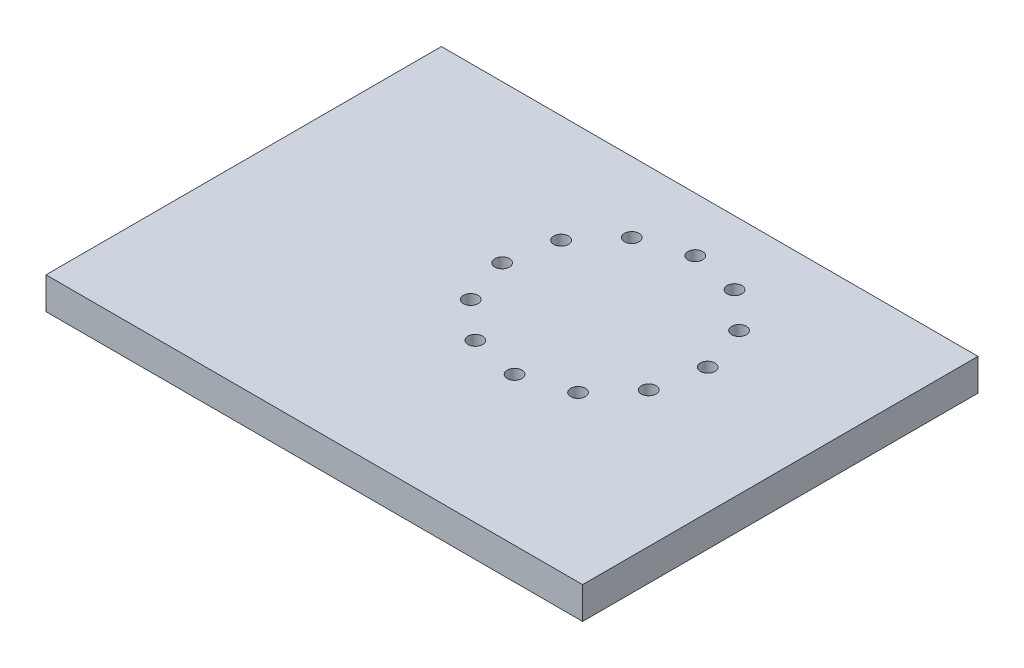
ISO-10303-21;
HEADER;
FILE_DESCRIPTION(('STEP AP214'),'2;1');
FILE_NAME('part.step','',(''),(''),'','','');
FILE_SCHEMA(('AUTOMOTIVE_DESIGN { 1 0 10303 214 1 1 1 1 }'));
ENDSEC;
DATA;
#1=APPLICATION_CONTEXT('core data for automotive mechanical design processes');
#2=APPLICATION_PROTOCOL_DEFINITION('international standard','automotive_design',2000,#1);
#3=PRODUCT_CONTEXT('',#1,'mechanical');
#4=PRODUCT('Part','Part','',(#3));
#5=PRODUCT_RELATED_PRODUCT_CATEGORY('part','',(#4));
#6=PRODUCT_DEFINITION_FORMATION('','',#4);
#7=PRODUCT_DEFINITION_CONTEXT('part definition',#1,'design');
#8=PRODUCT_DEFINITION('design','',#6,#7);
#9=PRODUCT_DEFINITION_SHAPE('','',#8);
#10=(LENGTH_UNIT() NAMED_UNIT(*) SI_UNIT(.MILLI.,.METRE.));
#11=(NAMED_UNIT(*) PLANE_ANGLE_UNIT() SI_UNIT($,.RADIAN.));
#12=(NAMED_UNIT(*) SI_UNIT($,.STERADIAN.) SOLID_ANGLE_UNIT());
#13=UNCERTAINTY_MEASURE_WITH_UNIT(LENGTH_MEASURE(1.E-05),#10,'distance_accuracy_value','');
#14=(GEOMETRIC_REPRESENTATION_CONTEXT(3) GLOBAL_UNCERTAINTY_ASSIGNED_CONTEXT((#13)) GLOBAL_UNIT_ASSIGNED_CONTEXT((#10,
#11,#12)) REPRESENTATION_CONTEXT('',''));
#15=CARTESIAN_POINT('',(0.,0.,0.));
#16=DIRECTION('',(0.,0.,1.));
#17=DIRECTION('',(1.,0.,0.));
#18=AXIS2_PLACEMENT_3D('',#15,#16,#17);
#19=CARTESIAN_POINT('',(0.,14.351,0.));
#20=DIRECTION('',(1.,0.,0.));
#21=DIRECTION('',(0.,0.,-1.));
#22=AXIS2_PLACEMENT_3D('',#19,#20,#21);
#23=PLANE('',#22);
#24=DIRECTION('',(0.,0.,1.));
#25=VECTOR('',#24,1.);
#26=CARTESIAN_POINT('',(0.,0.,0.));
#27=LINE('',#26,#25);
#28=CARTESIAN_POINT('',(0.,0.,-177.8));
#29=VERTEX_POINT('',#28);
#30=CARTESIAN_POINT('',(0.,0.,0.));
#31=VERTEX_POINT('',#30);
#32=EDGE_CURVE('E112',#29,#31,#27,.T.);
#33=ORIENTED_EDGE('',*,*,#32,.T.);
#34=DIRECTION('',(0.,-1.,0.));
#35=VECTOR('',#34,1.);
#36=CARTESIAN_POINT('',(0.,14.351,0.));
#37=LINE('',#36,#35);
#38=CARTESIAN_POINT('',(0.,14.351,0.));
#39=VERTEX_POINT('',#38);
#40=EDGE_CURVE('E12',#39,#31,#37,.T.);
#41=ORIENTED_EDGE('',*,*,#40,.F.);
#42=DIRECTION('',(0.,0.,1.));
#43=VECTOR('',#42,1.);
#44=CARTESIAN_POINT('',(0.,14.351,0.));
#45=LINE('',#44,#43);
#46=CARTESIAN_POINT('',(0.,14.351,-177.8));
#47=VERTEX_POINT('',#46);
#48=EDGE_CURVE('E100',#47,#39,#45,.T.);
#49=ORIENTED_EDGE('',*,*,#48,.F.);
#50=DIRECTION('',(0.,-1.,0.));
#51=VECTOR('',#50,1.);
#52=CARTESIAN_POINT('',(0.,14.351,-177.8));
#53=LINE('',#52,#51);
#54=EDGE_CURVE('E108',#47,#29,#53,.T.);
#55=ORIENTED_EDGE('',*,*,#54,.T.);
#56=EDGE_LOOP('',(#33,#41,#49,#55));
#57=FACE_BOUND('',#56,.T.);
#58=ADVANCED_FACE('F47',(#57),#23,.F.);
#59=CARTESIAN_POINT('',(0.,14.351,0.));
#60=DIRECTION('',(0.,0.,-1.));
#61=DIRECTION('',(-1.,0.,0.));
#62=AXIS2_PLACEMENT_3D('',#59,#60,#61);
#63=PLANE('',#62);
#64=DIRECTION('',(1.,0.,0.));
#65=VECTOR('',#64,1.);
#66=CARTESIAN_POINT('',(0.,0.,0.));
#67=LINE('',#66,#65);
#68=CARTESIAN_POINT('',(241.3,0.,0.));
#69=VERTEX_POINT('',#68);
#70=EDGE_CURVE('E104',#31,#69,#67,.T.);
#71=ORIENTED_EDGE('',*,*,#70,.T.);
#72=DIRECTION('',(0.,-1.,0.));
#73=VECTOR('',#72,1.);
#74=CARTESIAN_POINT('',(241.3,14.351,0.));
#75=LINE('',#74,#73);
#76=CARTESIAN_POINT('',(241.3,14.351,0.));
#77=VERTEX_POINT('',#76);
#78=EDGE_CURVE('E55',#77,#69,#75,.T.);
#79=ORIENTED_EDGE('',*,*,#78,.F.);
#80=DIRECTION('',(1.,0.,0.));
#81=VECTOR('',#80,1.);
#82=CARTESIAN_POINT('',(0.,14.351,0.));
#83=LINE('',#82,#81);
#84=EDGE_CURVE('E95',#39,#77,#83,.T.);
#85=ORIENTED_EDGE('',*,*,#84,.F.);
#86=ORIENTED_EDGE('',*,*,#40,.T.);
#87=EDGE_LOOP('',(#71,#79,#85,#86));
#88=FACE_BOUND('',#87,.T.);
#89=ADVANCED_FACE('F103',(#88),#63,.F.);
#90=CARTESIAN_POINT('',(241.3,14.351,0.));
#91=DIRECTION('',(-1.,0.,0.));
#92=DIRECTION('',(0.,0.,1.));
#93=AXIS2_PLACEMENT_3D('',#90,#91,#92);
#94=PLANE('',#93);
#95=DIRECTION('',(0.,0.,-1.));
#96=VECTOR('',#95,1.);
#97=CARTESIAN_POINT('',(241.3,0.,0.));
#98=LINE('',#97,#96);
#99=CARTESIAN_POINT('',(241.3,0.,-177.8));
#100=VERTEX_POINT('',#99);
#101=EDGE_CURVE('E82',#69,#100,#98,.T.);
#102=ORIENTED_EDGE('',*,*,#101,.T.);
#103=DIRECTION('',(0.,-1.,0.));
#104=VECTOR('',#103,1.);
#105=CARTESIAN_POINT('',(241.3,14.351,-177.8));
#106=LINE('',#105,#104);
#107=CARTESIAN_POINT('',(241.3,14.351,-177.8));
#108=VERTEX_POINT('',#107);
#109=EDGE_CURVE('E105',#108,#100,#106,.T.);
#110=ORIENTED_EDGE('',*,*,#109,.F.);
#111=DIRECTION('',(0.,0.,-1.));
#112=VECTOR('',#111,1.);
#113=CARTESIAN_POINT('',(241.3,14.351,0.));
#114=LINE('',#113,#112);
#115=EDGE_CURVE('E98',#77,#108,#114,.T.);
#116=ORIENTED_EDGE('',*,*,#115,.F.);
#117=ORIENTED_EDGE('',*,*,#78,.T.);
#118=EDGE_LOOP('',(#102,#110,#116,#117));
#119=FACE_BOUND('',#118,.T.);
#120=ADVANCED_FACE('F106',(#119),#94,.F.);
#121=CARTESIAN_POINT('',(0.,14.351,-177.8));
#122=DIRECTION('',(0.,0.,1.));
#123=DIRECTION('',(1.,0.,0.));
#124=AXIS2_PLACEMENT_3D('',#121,#122,#123);
#125=PLANE('',#124);
#126=DIRECTION('',(-1.,0.,0.));
#127=VECTOR('',#126,1.);
#128=CARTESIAN_POINT('',(0.,0.,-177.8));
#129=LINE('',#128,#127);
#130=EDGE_CURVE('E88',#100,#29,#129,.T.);
#131=ORIENTED_EDGE('',*,*,#130,.T.);
#132=ORIENTED_EDGE('',*,*,#54,.F.);
#133=DIRECTION('',(-1.,0.,0.));
#134=VECTOR('',#133,1.);
#135=CARTESIAN_POINT('',(0.,14.351,-177.8));
#136=LINE('',#135,#134);
#137=EDGE_CURVE('E65',#108,#47,#136,.T.);
#138=ORIENTED_EDGE('',*,*,#137,.F.);
#139=ORIENTED_EDGE('',*,*,#109,.T.);
#140=EDGE_LOOP('',(#131,#132,#138,#139));
#141=FACE_BOUND('',#140,.T.);
#142=ADVANCED_FACE('F120',(#141),#125,.F.);
#143=CARTESIAN_POINT('',(0.,14.351,0.));
#144=DIRECTION('',(0.,-1.,0.));
#145=DIRECTION('',(0.,0.,-1.));
#146=AXIS2_PLACEMENT_3D('',#143,#144,#145);
#147=PLANE('',#146);
#148=CARTESIAN_POINT('',(122.030882614296,14.351,-71.0203254002302));
#149=DIRECTION('',(0.,1.,0.));
#150=DIRECTION('',(0.,0.,1.));
#151=AXIS2_PLACEMENT_3D('',#148,#149,#150);
#152=CIRCLE('',#151,3.3);
#153=CARTESIAN_POINT('',(122.030882614296,14.351,-67.7203254002302));
#154=VERTEX_POINT('',#153);
#155=EDGE_CURVE('E219',#154,#154,#152,.T.);
#156=ORIENTED_EDGE('',*,*,#155,.F.);
#157=EDGE_LOOP('',(#156));
#158=FACE_BOUND('',#157,.T.);
#159=CARTESIAN_POINT('',(165.441282741422,14.351,-73.8108757790625));
#160=DIRECTION('',(0.,1.,0.));
#161=DIRECTION('',(0.,0.,1.));
#162=AXIS2_PLACEMENT_3D('',#159,#160,#161);
#163=CIRCLE('',#162,3.29999999999998);
#164=CARTESIAN_POINT('',(165.441282741422,14.351,-70.5108757790625));
#165=VERTEX_POINT('',#164);
#166=EDGE_CURVE('E134',#165,#165,#163,.T.);
#167=ORIENTED_EDGE('',*,*,#166,.F.);
#168=EDGE_LOOP('',(#167));
#169=FACE_BOUND('',#168,.T.);
#170=CARTESIAN_POINT('',(144.109945538082,14.351,-66.5997097610587));
#171=DIRECTION('',(0.,1.,0.));
#172=DIRECTION('',(0.,0.,1.));
#173=AXIS2_PLACEMENT_3D('',#170,#171,#172);
#174=CIRCLE('',#173,3.29999999999998);
#175=CARTESIAN_POINT('',(144.109945538082,14.351,-63.2997097610587));
#176=VERTEX_POINT('',#175);
#177=EDGE_CURVE('E212',#176,#176,#174,.T.);
#178=ORIENTED_EDGE('',*,*,#177,.F.);
#179=EDGE_LOOP('',(#178));
#180=FACE_BOUND('',#179,.T.);
#181=CARTESIAN_POINT('',(105.120161050127,14.351,-85.8882223060128));
#182=DIRECTION('',(0.,1.,0.));
#183=DIRECTION('',(0.,0.,1.));
#184=AXIS2_PLACEMENT_3D('',#181,#182,#183);
#185=CIRCLE('',#184,3.29999999999999);
#186=CARTESIAN_POINT('',(105.120161050127,14.351,-82.5882223060128));
#187=VERTEX_POINT('',#186);
#188=EDGE_CURVE('E203',#187,#187,#185,.T.);
#189=ORIENTED_EDGE('',*,*,#188,.F.);
#190=EDGE_LOOP('',(#189));
#191=FACE_BOUND('',#190,.T.);
#192=CARTESIAN_POINT('',(97.9089950321234,14.351,-107.219559509353));
#193=DIRECTION('',(0.,1.,0.));
#194=DIRECTION('',(0.,0.,1.));
#195=AXIS2_PLACEMENT_3D('',#192,#193,#194);
#196=CIRCLE('',#195,3.3);
#197=CARTESIAN_POINT('',(97.9089950321234,14.351,-103.919559509353));
#198=VERTEX_POINT('',#197);
#199=EDGE_CURVE('E196',#198,#198,#196,.T.);
#200=ORIENTED_EDGE('',*,*,#199,.F.);
#201=EDGE_LOOP('',(#200));
#202=FACE_BOUND('',#201,.T.);
#203=CARTESIAN_POINT('',(102.329610671295,14.351,-129.298622433139));
#204=DIRECTION('',(0.,1.,0.));
#205=DIRECTION('',(0.,0.,1.));
#206=AXIS2_PLACEMENT_3D('',#203,#204,#205);
#207=CIRCLE('',#206,3.29999999999998);
#208=CARTESIAN_POINT('',(102.329610671295,14.351,-125.998622433139));
#209=VERTEX_POINT('',#208);
#210=EDGE_CURVE('E189',#209,#209,#207,.T.);
#211=ORIENTED_EDGE('',*,*,#210,.F.);
#212=EDGE_LOOP('',(#211));
#213=FACE_BOUND('',#212,.T.);
#214=CARTESIAN_POINT('',(117.197507577078,14.351,-146.209343997307));
#215=DIRECTION('',(0.,1.,0.));
#216=DIRECTION('',(0.,0.,1.));
#217=AXIS2_PLACEMENT_3D('',#214,#215,#216);
#218=CIRCLE('',#217,3.3);
#219=CARTESIAN_POINT('',(117.197507577078,14.351,-142.909343997307));
#220=VERTEX_POINT('',#219);
#221=EDGE_CURVE('E181',#220,#220,#218,.T.);
#222=ORIENTED_EDGE('',*,*,#221,.F.);
#223=EDGE_LOOP('',(#222));
#224=FACE_BOUND('',#223,.T.);
#225=CARTESIAN_POINT('',(138.528844780417,14.351,-153.420510015311));
#226=DIRECTION('',(0.,1.,0.));
#227=DIRECTION('',(0.,0.,1.));
#228=AXIS2_PLACEMENT_3D('',#225,#226,#227);
#229=CIRCLE('',#228,3.29999999999998);
#230=CARTESIAN_POINT('',(138.528844780417,14.351,-150.120510015311));
#231=VERTEX_POINT('',#230);
#232=EDGE_CURVE('E174',#231,#231,#229,.T.);
#233=ORIENTED_EDGE('',*,*,#232,.F.);
#234=EDGE_LOOP('',(#233));
#235=FACE_BOUND('',#234,.T.);
#236=CARTESIAN_POINT('',(160.607907704203,14.351,-148.99989437614));
#237=DIRECTION('',(0.,1.,0.));
#238=DIRECTION('',(0.,0.,1.));
#239=AXIS2_PLACEMENT_3D('',#236,#237,#238);
#240=CIRCLE('',#239,3.3);
#241=CARTESIAN_POINT('',(160.607907704203,14.351,-145.69989437614));
#242=VERTEX_POINT('',#241);
#243=EDGE_CURVE('E163',#242,#242,#240,.T.);
#244=ORIENTED_EDGE('',*,*,#243,.F.);
#245=EDGE_LOOP('',(#244));
#246=FACE_BOUND('',#245,.T.);
#247=CARTESIAN_POINT('',(177.518629268372,14.351,-134.131997470357));
#248=DIRECTION('',(0.,1.,0.));
#249=DIRECTION('',(0.,0.,1.));
#250=AXIS2_PLACEMENT_3D('',#247,#248,#249);
#251=CIRCLE('',#250,3.3);
#252=CARTESIAN_POINT('',(177.518629268372,14.351,-130.831997470357));
#253=VERTEX_POINT('',#252);
#254=EDGE_CURVE('E155',#253,#253,#251,.T.);
#255=ORIENTED_EDGE('',*,*,#254,.F.);
#256=EDGE_LOOP('',(#255));
#257=FACE_BOUND('',#256,.T.);
#258=CARTESIAN_POINT('',(184.729795286376,14.351,-112.800660267017));
#259=DIRECTION('',(0.,1.,0.));
#260=DIRECTION('',(0.,0.,1.));
#261=AXIS2_PLACEMENT_3D('',#258,#259,#260);
#262=CIRCLE('',#261,3.29999999999998);
#263=CARTESIAN_POINT('',(184.729795286376,14.351,-109.500660267017));
#264=VERTEX_POINT('',#263);
#265=EDGE_CURVE('E148',#264,#264,#262,.T.);
#266=ORIENTED_EDGE('',*,*,#265,.F.);
#267=EDGE_LOOP('',(#266));
#268=FACE_BOUND('',#267,.T.);
#269=CARTESIAN_POINT('',(180.309179647204,14.351,-90.7215973432309));
#270=DIRECTION('',(0.,1.,0.));
#271=DIRECTION('',(0.,0.,1.));
#272=AXIS2_PLACEMENT_3D('',#269,#270,#271);
#273=CIRCLE('',#272,3.3);
#274=CARTESIAN_POINT('',(180.309179647204,14.351,-87.4215973432309));
#275=VERTEX_POINT('',#274);
#276=EDGE_CURVE('E126',#275,#275,#273,.T.);
#277=ORIENTED_EDGE('',*,*,#276,.F.);
#278=EDGE_LOOP('',(#277));
#279=FACE_BOUND('',#278,.T.);
#280=ORIENTED_EDGE('',*,*,#48,.T.);
#281=ORIENTED_EDGE('',*,*,#84,.T.);
#282=ORIENTED_EDGE('',*,*,#115,.T.);
#283=ORIENTED_EDGE('',*,*,#137,.T.);
#284=EDGE_LOOP('',(#280,#281,#282,#283));
#285=FACE_BOUND('',#284,.T.);
#286=ADVANCED_FACE('F96',(#158,#169,#180,#191,#202,#213,#224,#235,#246,#257,#268,#279,#285),
#147,.F.);
#287=CARTESIAN_POINT('',(0.,0.,0.));
#288=DIRECTION('',(0.,-1.,0.));
#289=DIRECTION('',(0.,0.,-1.));
#290=AXIS2_PLACEMENT_3D('',#287,#288,#289);
#291=PLANE('',#290);
#292=CARTESIAN_POINT('',(122.030882614296,0.,-71.0203254002302));
#293=DIRECTION('',(0.,1.,0.));
#294=DIRECTION('',(0.,0.,1.));
#295=AXIS2_PLACEMENT_3D('',#292,#293,#294);
#296=CIRCLE('',#295,3.3);
#297=CARTESIAN_POINT('',(122.030882614296,0.,-67.7203254002302));
#298=VERTEX_POINT('',#297);
#299=EDGE_CURVE('E206',#298,#298,#296,.T.);
#300=ORIENTED_EDGE('',*,*,#299,.T.);
#301=EDGE_LOOP('',(#300));
#302=FACE_BOUND('',#301,.T.);
#303=CARTESIAN_POINT('',(165.441282741422,0.,-73.8108757790625));
#304=DIRECTION('',(0.,1.,0.));
#305=DIRECTION('',(0.,0.,1.));
#306=AXIS2_PLACEMENT_3D('',#303,#304,#305);
#307=CIRCLE('',#306,3.29999999999998);
#308=CARTESIAN_POINT('',(165.441282741422,0.,-70.5108757790625));
#309=VERTEX_POINT('',#308);
#310=EDGE_CURVE('E221',#309,#309,#307,.T.);
#311=ORIENTED_EDGE('',*,*,#310,.T.);
#312=EDGE_LOOP('',(#311));
#313=FACE_BOUND('',#312,.T.);
#314=CARTESIAN_POINT('',(144.109945538082,0.,-66.5997097610587));
#315=DIRECTION('',(0.,1.,0.));
#316=DIRECTION('',(0.,0.,1.));
#317=AXIS2_PLACEMENT_3D('',#314,#315,#316);
#318=CIRCLE('',#317,3.29999999999998);
#319=CARTESIAN_POINT('',(144.109945538082,0.,-63.2997097610587));
#320=VERTEX_POINT('',#319);
#321=EDGE_CURVE('E207',#320,#320,#318,.T.);
#322=ORIENTED_EDGE('',*,*,#321,.T.);
#323=EDGE_LOOP('',(#322));
#324=FACE_BOUND('',#323,.T.);
#325=CARTESIAN_POINT('',(105.120161050127,0.,-85.8882223060128));
#326=DIRECTION('',(0.,1.,0.));
#327=DIRECTION('',(0.,0.,1.));
#328=AXIS2_PLACEMENT_3D('',#325,#326,#327);
#329=CIRCLE('',#328,3.29999999999999);
#330=CARTESIAN_POINT('',(105.120161050127,0.,-82.5882223060128));
#331=VERTEX_POINT('',#330);
#332=EDGE_CURVE('E198',#331,#331,#329,.T.);
#333=ORIENTED_EDGE('',*,*,#332,.T.);
#334=EDGE_LOOP('',(#333));
#335=FACE_BOUND('',#334,.T.);
#336=CARTESIAN_POINT('',(97.9089950321234,0.,-107.219559509353));
#337=DIRECTION('',(0.,1.,0.));
#338=DIRECTION('',(0.,0.,1.));
#339=AXIS2_PLACEMENT_3D('',#336,#337,#338);
#340=CIRCLE('',#339,3.3);
#341=CARTESIAN_POINT('',(97.9089950321234,0.,-103.919559509353));
#342=VERTEX_POINT('',#341);
#343=EDGE_CURVE('E191',#342,#342,#340,.T.);
#344=ORIENTED_EDGE('',*,*,#343,.T.);
#345=EDGE_LOOP('',(#344));
#346=FACE_BOUND('',#345,.T.);
#347=CARTESIAN_POINT('',(102.329610671295,0.,-129.298622433139));
#348=DIRECTION('',(0.,1.,0.));
#349=DIRECTION('',(0.,0.,1.));
#350=AXIS2_PLACEMENT_3D('',#347,#348,#349);
#351=CIRCLE('',#350,3.29999999999998);
#352=CARTESIAN_POINT('',(102.329610671295,0.,-125.998622433139));
#353=VERTEX_POINT('',#352);
#354=EDGE_CURVE('E184',#353,#353,#351,.T.);
#355=ORIENTED_EDGE('',*,*,#354,.T.);
#356=EDGE_LOOP('',(#355));
#357=FACE_BOUND('',#356,.T.);
#358=CARTESIAN_POINT('',(117.197507577078,0.,-146.209343997307));
#359=DIRECTION('',(0.,1.,0.));
#360=DIRECTION('',(0.,0.,1.));
#361=AXIS2_PLACEMENT_3D('',#358,#359,#360);
#362=CIRCLE('',#361,3.3);
#363=CARTESIAN_POINT('',(117.197507577078,0.,-142.909343997307));
#364=VERTEX_POINT('',#363);
#365=EDGE_CURVE('E176',#364,#364,#362,.T.);
#366=ORIENTED_EDGE('',*,*,#365,.T.);
#367=EDGE_LOOP('',(#366));
#368=FACE_BOUND('',#367,.T.);
#369=CARTESIAN_POINT('',(138.528844780417,0.,-153.420510015311));
#370=DIRECTION('',(0.,1.,0.));
#371=DIRECTION('',(0.,0.,1.));
#372=AXIS2_PLACEMENT_3D('',#369,#370,#371);
#373=CIRCLE('',#372,3.29999999999998);
#374=CARTESIAN_POINT('',(138.528844780417,0.,-150.120510015311));
#375=VERTEX_POINT('',#374);
#376=EDGE_CURVE('E169',#375,#375,#373,.T.);
#377=ORIENTED_EDGE('',*,*,#376,.T.);
#378=EDGE_LOOP('',(#377));
#379=FACE_BOUND('',#378,.T.);
#380=CARTESIAN_POINT('',(160.607907704203,0.,-148.99989437614));
#381=DIRECTION('',(0.,1.,0.));
#382=DIRECTION('',(0.,0.,1.));
#383=AXIS2_PLACEMENT_3D('',#380,#381,#382);
#384=CIRCLE('',#383,3.3);
#385=CARTESIAN_POINT('',(160.607907704203,0.,-145.69989437614));
#386=VERTEX_POINT('',#385);
#387=EDGE_CURVE('E158',#386,#386,#384,.T.);
#388=ORIENTED_EDGE('',*,*,#387,.T.);
#389=EDGE_LOOP('',(#388));
#390=FACE_BOUND('',#389,.T.);
#391=CARTESIAN_POINT('',(177.518629268372,0.,-134.131997470357));
#392=DIRECTION('',(0.,1.,0.));
#393=DIRECTION('',(0.,0.,1.));
#394=AXIS2_PLACEMENT_3D('',#391,#392,#393);
#395=CIRCLE('',#394,3.3);
#396=CARTESIAN_POINT('',(177.518629268372,0.,-130.831997470357));
#397=VERTEX_POINT('',#396);
#398=EDGE_CURVE('E150',#397,#397,#395,.T.);
#399=ORIENTED_EDGE('',*,*,#398,.T.);
#400=EDGE_LOOP('',(#399));
#401=FACE_BOUND('',#400,.T.);
#402=CARTESIAN_POINT('',(184.729795286376,0.,-112.800660267017));
#403=DIRECTION('',(0.,1.,0.));
#404=DIRECTION('',(0.,0.,1.));
#405=AXIS2_PLACEMENT_3D('',#402,#403,#404);
#406=CIRCLE('',#405,3.29999999999998);
#407=CARTESIAN_POINT('',(184.729795286376,0.,-109.500660267017));
#408=VERTEX_POINT('',#407);
#409=EDGE_CURVE('E129',#408,#408,#406,.T.);
#410=ORIENTED_EDGE('',*,*,#409,.T.);
#411=EDGE_LOOP('',(#410));
#412=FACE_BOUND('',#411,.T.);
#413=CARTESIAN_POINT('',(180.309179647204,0.,-90.7215973432309));
#414=DIRECTION('',(0.,1.,0.));
#415=DIRECTION('',(0.,0.,1.));
#416=AXIS2_PLACEMENT_3D('',#413,#414,#415);
#417=CIRCLE('',#416,3.3);
#418=CARTESIAN_POINT('',(180.309179647204,0.,-87.4215973432309));
#419=VERTEX_POINT('',#418);
#420=EDGE_CURVE('E115',#419,#419,#417,.T.);
#421=ORIENTED_EDGE('',*,*,#420,.T.);
#422=EDGE_LOOP('',(#421));
#423=FACE_BOUND('',#422,.T.);
#424=ORIENTED_EDGE('',*,*,#32,.F.);
#425=ORIENTED_EDGE('',*,*,#130,.F.);
#426=ORIENTED_EDGE('',*,*,#101,.F.);
#427=ORIENTED_EDGE('',*,*,#70,.F.);
#428=EDGE_LOOP('',(#424,#425,#426,#427));
#429=FACE_BOUND('',#428,.T.);
#430=ADVANCED_FACE('F123',(#302,#313,#324,#335,#346,#357,#368,#379,#390,#401,#412,#423,#429),
#291,.T.);
#431=CARTESIAN_POINT('',(180.309179647204,0.,-90.7215973432309));
#432=DIRECTION('',(0.,1.,0.));
#433=DIRECTION('',(0.,0.,1.));
#434=AXIS2_PLACEMENT_3D('',#431,#432,#433);
#435=CYLINDRICAL_SURFACE('',#434,3.3);
#436=ORIENTED_EDGE('',*,*,#420,.F.);
#437=EDGE_LOOP('',(#436));
#438=FACE_BOUND('',#437,.T.);
#439=ORIENTED_EDGE('',*,*,#276,.T.);
#440=EDGE_LOOP('',(#439));
#441=FACE_BOUND('',#440,.T.);
#442=ADVANCED_FACE('F259',(#438,#441),#435,.F.);
#443=CARTESIAN_POINT('',(184.729795286376,0.,-112.800660267017));
#444=DIRECTION('',(0.,1.,0.));
#445=DIRECTION('',(0.,0.,1.));
#446=AXIS2_PLACEMENT_3D('',#443,#444,#445);
#447=CYLINDRICAL_SURFACE('',#446,3.29999999999998);
#448=ORIENTED_EDGE('',*,*,#409,.F.);
#449=EDGE_LOOP('',(#448));
#450=FACE_BOUND('',#449,.T.);
#451=ORIENTED_EDGE('',*,*,#265,.T.);
#452=EDGE_LOOP('',(#451));
#453=FACE_BOUND('',#452,.T.);
#454=ADVANCED_FACE('F261',(#450,#453),#447,.F.);
#455=CARTESIAN_POINT('',(177.518629268372,0.,-134.131997470357));
#456=DIRECTION('',(0.,1.,0.));
#457=DIRECTION('',(0.,0.,1.));
#458=AXIS2_PLACEMENT_3D('',#455,#456,#457);
#459=CYLINDRICAL_SURFACE('',#458,3.3);
#460=ORIENTED_EDGE('',*,*,#398,.F.);
#461=EDGE_LOOP('',(#460));
#462=FACE_BOUND('',#461,.T.);
#463=ORIENTED_EDGE('',*,*,#254,.T.);
#464=EDGE_LOOP('',(#463));
#465=FACE_BOUND('',#464,.T.);
#466=ADVANCED_FACE('F268',(#462,#465),#459,.F.);
#467=CARTESIAN_POINT('',(160.607907704203,0.,-148.99989437614));
#468=DIRECTION('',(0.,1.,0.));
#469=DIRECTION('',(0.,0.,1.));
#470=AXIS2_PLACEMENT_3D('',#467,#468,#469);
#471=CYLINDRICAL_SURFACE('',#470,3.3);
#472=ORIENTED_EDGE('',*,*,#387,.F.);
#473=EDGE_LOOP('',(#472));
#474=FACE_BOUND('',#473,.T.);
#475=ORIENTED_EDGE('',*,*,#243,.T.);
#476=EDGE_LOOP('',(#475));
#477=FACE_BOUND('',#476,.T.);
#478=ADVANCED_FACE('F363',(#474,#477),#471,.F.);
#479=CARTESIAN_POINT('',(138.528844780417,0.,-153.420510015311));
#480=DIRECTION('',(0.,1.,0.));
#481=DIRECTION('',(0.,0.,1.));
#482=AXIS2_PLACEMENT_3D('',#479,#480,#481);
#483=CYLINDRICAL_SURFACE('',#482,3.29999999999998);
#484=ORIENTED_EDGE('',*,*,#376,.F.);
#485=EDGE_LOOP('',(#484));
#486=FACE_BOUND('',#485,.T.);
#487=ORIENTED_EDGE('',*,*,#232,.T.);
#488=EDGE_LOOP('',(#487));
#489=FACE_BOUND('',#488,.T.);
#490=ADVANCED_FACE('F373',(#486,#489),#483,.F.);
#491=CARTESIAN_POINT('',(117.197507577078,0.,-146.209343997307));
#492=DIRECTION('',(0.,1.,0.));
#493=DIRECTION('',(0.,0.,1.));
#494=AXIS2_PLACEMENT_3D('',#491,#492,#493);
#495=CYLINDRICAL_SURFACE('',#494,3.3);
#496=ORIENTED_EDGE('',*,*,#365,.F.);
#497=EDGE_LOOP('',(#496));
#498=FACE_BOUND('',#497,.T.);
#499=ORIENTED_EDGE('',*,*,#221,.T.);
#500=EDGE_LOOP('',(#499));
#501=FACE_BOUND('',#500,.T.);
#502=ADVANCED_FACE('F383',(#498,#501),#495,.F.);
#503=CARTESIAN_POINT('',(102.329610671295,0.,-129.298622433139));
#504=DIRECTION('',(0.,1.,0.));
#505=DIRECTION('',(0.,0.,1.));
#506=AXIS2_PLACEMENT_3D('',#503,#504,#505);
#507=CYLINDRICAL_SURFACE('',#506,3.29999999999998);
#508=ORIENTED_EDGE('',*,*,#354,.F.);
#509=EDGE_LOOP('',(#508));
#510=FACE_BOUND('',#509,.T.);
#511=ORIENTED_EDGE('',*,*,#210,.T.);
#512=EDGE_LOOP('',(#511));
#513=FACE_BOUND('',#512,.T.);
#514=ADVANCED_FACE('F393',(#510,#513),#507,.F.);
#515=CARTESIAN_POINT('',(97.9089950321234,0.,-107.219559509353));
#516=DIRECTION('',(0.,1.,0.));
#517=DIRECTION('',(0.,0.,1.));
#518=AXIS2_PLACEMENT_3D('',#515,#516,#517);
#519=CYLINDRICAL_SURFACE('',#518,3.3);
#520=ORIENTED_EDGE('',*,*,#343,.F.);
#521=EDGE_LOOP('',(#520));
#522=FACE_BOUND('',#521,.T.);
#523=ORIENTED_EDGE('',*,*,#199,.T.);
#524=EDGE_LOOP('',(#523));
#525=FACE_BOUND('',#524,.T.);
#526=ADVANCED_FACE('F403',(#522,#525),#519,.F.);
#527=CARTESIAN_POINT('',(105.120161050127,0.,-85.8882223060128));
#528=DIRECTION('',(0.,1.,0.));
#529=DIRECTION('',(0.,0.,1.));
#530=AXIS2_PLACEMENT_3D('',#527,#528,#529);
#531=CYLINDRICAL_SURFACE('',#530,3.29999999999999);
#532=ORIENTED_EDGE('',*,*,#332,.F.);
#533=EDGE_LOOP('',(#532));
#534=FACE_BOUND('',#533,.T.);
#535=ORIENTED_EDGE('',*,*,#188,.T.);
#536=EDGE_LOOP('',(#535));
#537=FACE_BOUND('',#536,.T.);
#538=ADVANCED_FACE('F413',(#534,#537),#531,.F.);
#539=CARTESIAN_POINT('',(144.109945538082,0.,-66.5997097610587));
#540=DIRECTION('',(0.,1.,0.));
#541=DIRECTION('',(0.,0.,1.));
#542=AXIS2_PLACEMENT_3D('',#539,#540,#541);
#543=CYLINDRICAL_SURFACE('',#542,3.29999999999998);
#544=ORIENTED_EDGE('',*,*,#321,.F.);
#545=EDGE_LOOP('',(#544));
#546=FACE_BOUND('',#545,.T.);
#547=ORIENTED_EDGE('',*,*,#177,.T.);
#548=EDGE_LOOP('',(#547));
#549=FACE_BOUND('',#548,.T.);
#550=ADVANCED_FACE('F423',(#546,#549),#543,.F.);
#551=CARTESIAN_POINT('',(165.441282741422,0.,-73.8108757790625));
#552=DIRECTION('',(0.,1.,0.));
#553=DIRECTION('',(0.,0.,1.));
#554=AXIS2_PLACEMENT_3D('',#551,#552,#553);
#555=CYLINDRICAL_SURFACE('',#554,3.29999999999998);
#556=ORIENTED_EDGE('',*,*,#310,.F.);
#557=EDGE_LOOP('',(#556));
#558=FACE_BOUND('',#557,.T.);
#559=ORIENTED_EDGE('',*,*,#166,.T.);
#560=EDGE_LOOP('',(#559));
#561=FACE_BOUND('',#560,.T.);
#562=ADVANCED_FACE('F230',(#558,#561),#555,.F.);
#563=CARTESIAN_POINT('',(122.030882614296,0.,-71.0203254002302));
#564=DIRECTION('',(0.,1.,0.));
#565=DIRECTION('',(0.,0.,1.));
#566=AXIS2_PLACEMENT_3D('',#563,#564,#565);
#567=CYLINDRICAL_SURFACE('',#566,3.3);
#568=ORIENTED_EDGE('',*,*,#299,.F.);
#569=EDGE_LOOP('',(#568));
#570=FACE_BOUND('',#569,.T.);
#571=ORIENTED_EDGE('',*,*,#155,.T.);
#572=EDGE_LOOP('',(#571));
#573=FACE_BOUND('',#572,.T.);
#574=ADVANCED_FACE('F441',(#570,#573),#567,.F.);
#575=CLOSED_SHELL('',(#58,#89,#120,#142,#286,#430,#442,#454,#466,#478,#490,#502,#514,#526,#538,
#550,#562,#574));
#576=MANIFOLD_SOLID_BREP('B2',#575);
#577=ADVANCED_BREP_SHAPE_REPRESENTATION('',(#18,#576),#14);
#578=SHAPE_DEFINITION_REPRESENTATION(#9,#577);
ENDSEC;
END-ISO-10303-21;
